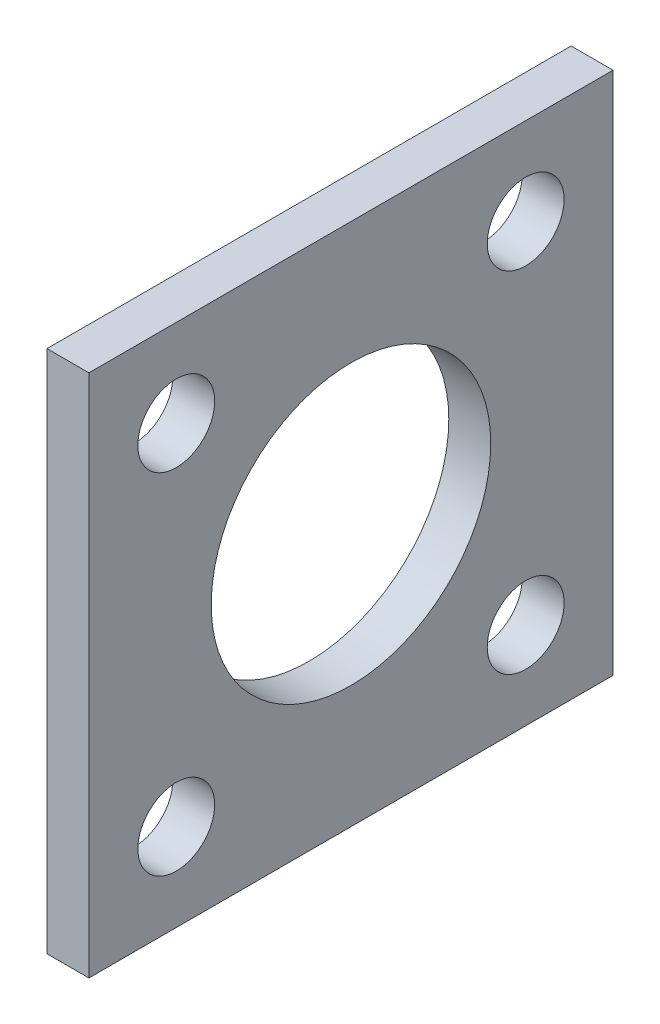
ISO-10303-21;
HEADER;
FILE_DESCRIPTION(('STEP AP214'),'2;1');
FILE_NAME('part.step','',(''),(''),'','','');
FILE_SCHEMA(('AUTOMOTIVE_DESIGN { 1 0 10303 214 1 1 1 1 }'));
ENDSEC;
DATA;
#1=APPLICATION_CONTEXT('core data for automotive mechanical design processes');
#2=APPLICATION_PROTOCOL_DEFINITION('international standard','automotive_design',2000,#1);
#3=PRODUCT_CONTEXT('',#1,'mechanical');
#4=PRODUCT('Part','Part','',(#3));
#5=PRODUCT_RELATED_PRODUCT_CATEGORY('part','',(#4));
#6=PRODUCT_DEFINITION_FORMATION('','',#4);
#7=PRODUCT_DEFINITION_CONTEXT('part definition',#1,'design');
#8=PRODUCT_DEFINITION('design','',#6,#7);
#9=PRODUCT_DEFINITION_SHAPE('','',#8);
#10=(LENGTH_UNIT() NAMED_UNIT(*) SI_UNIT(.MILLI.,.METRE.));
#11=(NAMED_UNIT(*) PLANE_ANGLE_UNIT() SI_UNIT($,.RADIAN.));
#12=(NAMED_UNIT(*) SI_UNIT($,.STERADIAN.) SOLID_ANGLE_UNIT());
#13=UNCERTAINTY_MEASURE_WITH_UNIT(LENGTH_MEASURE(1.E-05),#10,'distance_accuracy_value','');
#14=(GEOMETRIC_REPRESENTATION_CONTEXT(3) GLOBAL_UNCERTAINTY_ASSIGNED_CONTEXT((#13)) GLOBAL_UNIT_ASSIGNED_CONTEXT((#10,
#11,#12)) REPRESENTATION_CONTEXT('',''));
#15=CARTESIAN_POINT('',(0.,0.,0.));
#16=DIRECTION('',(0.,0.,1.));
#17=DIRECTION('',(1.,0.,0.));
#18=AXIS2_PLACEMENT_3D('',#15,#16,#17);
#19=CARTESIAN_POINT('',(6.,0.,0.));
#20=DIRECTION('',(1.,0.,0.));
#21=DIRECTION('',(0.,0.,-1.));
#22=AXIS2_PLACEMENT_3D('',#19,#20,#21);
#23=PLANE('',#22);
#24=CARTESIAN_POINT('',(6.,-25.,25.));
#25=DIRECTION('',(1.,0.,0.));
#26=DIRECTION('',(0.,0.,-1.));
#27=AXIS2_PLACEMENT_3D('',#24,#25,#26);
#28=CIRCLE('',#27,5.5);
#29=CARTESIAN_POINT('',(6.,-25.,19.5));
#30=VERTEX_POINT('',#29);
#31=EDGE_CURVE('E150',#30,#30,#28,.T.);
#32=ORIENTED_EDGE('',*,*,#31,.F.);
#33=EDGE_LOOP('',(#32));
#34=FACE_BOUND('',#33,.T.);
#35=CARTESIAN_POINT('',(6.,25.,25.));
#36=DIRECTION('',(1.,0.,0.));
#37=DIRECTION('',(0.,0.,1.));
#38=AXIS2_PLACEMENT_3D('',#35,#36,#37);
#39=CIRCLE('',#38,5.5);
#40=CARTESIAN_POINT('',(6.,25.,30.5));
#41=VERTEX_POINT('',#40);
#42=EDGE_CURVE('E134',#41,#41,#39,.T.);
#43=ORIENTED_EDGE('',*,*,#42,.F.);
#44=EDGE_LOOP('',(#43));
#45=FACE_BOUND('',#44,.T.);
#46=DIRECTION('',(0.,1.,0.));
#47=VECTOR('',#46,1.);
#48=CARTESIAN_POINT('',(6.,37.5,-37.5));
#49=LINE('',#48,#47);
#50=CARTESIAN_POINT('',(6.,-37.5,-37.5));
#51=VERTEX_POINT('',#50);
#52=CARTESIAN_POINT('',(6.,37.5,-37.5));
#53=VERTEX_POINT('',#52);
#54=EDGE_CURVE('E92',#51,#53,#49,.T.);
#55=ORIENTED_EDGE('',*,*,#54,.T.);
#56=DIRECTION('',(0.,0.,1.));
#57=VECTOR('',#56,1.);
#58=CARTESIAN_POINT('',(6.,37.5,37.5));
#59=LINE('',#58,#57);
#60=CARTESIAN_POINT('',(6.,37.5,37.5));
#61=VERTEX_POINT('',#60);
#62=EDGE_CURVE('E87',#53,#61,#59,.T.);
#63=ORIENTED_EDGE('',*,*,#62,.T.);
#64=DIRECTION('',(0.,-1.,0.));
#65=VECTOR('',#64,1.);
#66=CARTESIAN_POINT('',(6.,37.5,37.5));
#67=LINE('',#66,#65);
#68=CARTESIAN_POINT('',(6.,-37.5,37.5));
#69=VERTEX_POINT('',#68);
#70=EDGE_CURVE('E90',#61,#69,#67,.T.);
#71=ORIENTED_EDGE('',*,*,#70,.T.);
#72=DIRECTION('',(0.,0.,-1.));
#73=VECTOR('',#72,1.);
#74=CARTESIAN_POINT('',(6.,-37.5,37.5));
#75=LINE('',#74,#73);
#76=EDGE_CURVE('E57',#69,#51,#75,.T.);
#77=ORIENTED_EDGE('',*,*,#76,.T.);
#78=EDGE_LOOP('',(#55,#63,#71,#77));
#79=FACE_BOUND('',#78,.T.);
#80=CARTESIAN_POINT('',(6.,25.,-25.));
#81=DIRECTION('',(1.,0.,0.));
#82=DIRECTION('',(0.,0.,-1.));
#83=AXIS2_PLACEMENT_3D('',#80,#81,#82);
#84=CIRCLE('',#83,5.5);
#85=CARTESIAN_POINT('',(6.,25.,-30.5));
#86=VERTEX_POINT('',#85);
#87=EDGE_CURVE('E112',#86,#86,#84,.T.);
#88=ORIENTED_EDGE('',*,*,#87,.F.);
#89=EDGE_LOOP('',(#88));
#90=FACE_BOUND('',#89,.T.);
#91=CARTESIAN_POINT('',(6.,-25.,-25.));
#92=DIRECTION('',(1.,0.,0.));
#93=DIRECTION('',(0.,0.,1.));
#94=AXIS2_PLACEMENT_3D('',#91,#92,#93);
#95=CIRCLE('',#94,5.5);
#96=CARTESIAN_POINT('',(6.,-25.,-19.5));
#97=VERTEX_POINT('',#96);
#98=EDGE_CURVE('E142',#97,#97,#95,.T.);
#99=ORIENTED_EDGE('',*,*,#98,.F.);
#100=EDGE_LOOP('',(#99));
#101=FACE_BOUND('',#100,.T.);
#102=CARTESIAN_POINT('',(6.,0.,0.));
#103=DIRECTION('',(1.,0.,0.));
#104=DIRECTION('',(0.,0.,-1.));
#105=AXIS2_PLACEMENT_3D('',#102,#103,#104);
#106=CIRCLE('',#105,20.);
#107=CARTESIAN_POINT('',(6.,0.,-20.));
#108=VERTEX_POINT('',#107);
#109=EDGE_CURVE('E158',#108,#108,#106,.T.);
#110=ORIENTED_EDGE('',*,*,#109,.F.);
#111=EDGE_LOOP('',(#110));
#112=FACE_BOUND('',#111,.T.);
#113=ADVANCED_FACE('F39',(#34,#45,#79,#90,#101,#112),#23,.T.);
#114=CARTESIAN_POINT('',(0.,0.,0.));
#115=DIRECTION('',(1.,0.,0.));
#116=DIRECTION('',(0.,0.,-1.));
#117=AXIS2_PLACEMENT_3D('',#114,#115,#116);
#118=PLANE('',#117);
#119=DIRECTION('',(0.,1.,0.));
#120=VECTOR('',#119,1.);
#121=CARTESIAN_POINT('',(0.,37.5,-37.5));
#122=LINE('',#121,#120);
#123=CARTESIAN_POINT('',(0.,-37.5,-37.5));
#124=VERTEX_POINT('',#123);
#125=CARTESIAN_POINT('',(0.,37.5,-37.5));
#126=VERTEX_POINT('',#125);
#127=EDGE_CURVE('E108',#124,#126,#122,.T.);
#128=ORIENTED_EDGE('',*,*,#127,.F.);
#129=DIRECTION('',(0.,0.,-1.));
#130=VECTOR('',#129,1.);
#131=CARTESIAN_POINT('',(0.,-37.5,37.5));
#132=LINE('',#131,#130);
#133=CARTESIAN_POINT('',(0.,-37.5,37.5));
#134=VERTEX_POINT('',#133);
#135=EDGE_CURVE('E80',#134,#124,#132,.T.);
#136=ORIENTED_EDGE('',*,*,#135,.F.);
#137=DIRECTION('',(0.,-1.,0.));
#138=VECTOR('',#137,1.);
#139=CARTESIAN_POINT('',(0.,37.5,37.5));
#140=LINE('',#139,#138);
#141=CARTESIAN_POINT('',(0.,37.5,37.5));
#142=VERTEX_POINT('',#141);
#143=EDGE_CURVE('E74',#142,#134,#140,.T.);
#144=ORIENTED_EDGE('',*,*,#143,.F.);
#145=DIRECTION('',(0.,0.,1.));
#146=VECTOR('',#145,1.);
#147=CARTESIAN_POINT('',(0.,37.5,37.5));
#148=LINE('',#147,#146);
#149=EDGE_CURVE('E97',#126,#142,#148,.T.);
#150=ORIENTED_EDGE('',*,*,#149,.F.);
#151=EDGE_LOOP('',(#128,#136,#144,#150));
#152=FACE_BOUND('',#151,.T.);
#153=CARTESIAN_POINT('',(0.,25.,-25.));
#154=DIRECTION('',(1.,0.,0.));
#155=DIRECTION('',(0.,0.,-1.));
#156=AXIS2_PLACEMENT_3D('',#153,#154,#155);
#157=CIRCLE('',#156,5.5);
#158=CARTESIAN_POINT('',(0.,25.,-30.5));
#159=VERTEX_POINT('',#158);
#160=EDGE_CURVE('E130',#159,#159,#157,.T.);
#161=ORIENTED_EDGE('',*,*,#160,.T.);
#162=EDGE_LOOP('',(#161));
#163=FACE_BOUND('',#162,.T.);
#164=CARTESIAN_POINT('',(0.,25.,25.));
#165=DIRECTION('',(1.,0.,0.));
#166=DIRECTION('',(0.,0.,1.));
#167=AXIS2_PLACEMENT_3D('',#164,#165,#166);
#168=CIRCLE('',#167,5.5);
#169=CARTESIAN_POINT('',(0.,25.,30.5));
#170=VERTEX_POINT('',#169);
#171=EDGE_CURVE('E138',#170,#170,#168,.T.);
#172=ORIENTED_EDGE('',*,*,#171,.T.);
#173=EDGE_LOOP('',(#172));
#174=FACE_BOUND('',#173,.T.);
#175=CARTESIAN_POINT('',(0.,-25.,-25.));
#176=DIRECTION('',(1.,0.,0.));
#177=DIRECTION('',(0.,0.,1.));
#178=AXIS2_PLACEMENT_3D('',#175,#176,#177);
#179=CIRCLE('',#178,5.5);
#180=CARTESIAN_POINT('',(0.,-25.,-19.5));
#181=VERTEX_POINT('',#180);
#182=EDGE_CURVE('E146',#181,#181,#179,.T.);
#183=ORIENTED_EDGE('',*,*,#182,.T.);
#184=EDGE_LOOP('',(#183));
#185=FACE_BOUND('',#184,.T.);
#186=CARTESIAN_POINT('',(0.,-25.,25.));
#187=DIRECTION('',(1.,0.,0.));
#188=DIRECTION('',(0.,0.,-1.));
#189=AXIS2_PLACEMENT_3D('',#186,#187,#188);
#190=CIRCLE('',#189,5.5);
#191=CARTESIAN_POINT('',(0.,-25.,19.5));
#192=VERTEX_POINT('',#191);
#193=EDGE_CURVE('E154',#192,#192,#190,.T.);
#194=ORIENTED_EDGE('',*,*,#193,.T.);
#195=EDGE_LOOP('',(#194));
#196=FACE_BOUND('',#195,.T.);
#197=CARTESIAN_POINT('',(0.,0.,0.));
#198=DIRECTION('',(1.,0.,0.));
#199=DIRECTION('',(0.,0.,-1.));
#200=AXIS2_PLACEMENT_3D('',#197,#198,#199);
#201=CIRCLE('',#200,20.);
#202=CARTESIAN_POINT('',(0.,0.,-20.));
#203=VERTEX_POINT('',#202);
#204=EDGE_CURVE('E162',#203,#203,#201,.T.);
#205=ORIENTED_EDGE('',*,*,#204,.T.);
#206=EDGE_LOOP('',(#205));
#207=FACE_BOUND('',#206,.T.);
#208=ADVANCED_FACE('F125',(#152,#163,#174,#185,#196,#207),#118,.F.);
#209=CARTESIAN_POINT('',(6.,37.5,-37.5));
#210=DIRECTION('',(0.,0.,1.));
#211=DIRECTION('',(1.,0.,0.));
#212=AXIS2_PLACEMENT_3D('',#209,#210,#211);
#213=PLANE('',#212);
#214=ORIENTED_EDGE('',*,*,#127,.T.);
#215=DIRECTION('',(-1.,0.,0.));
#216=VECTOR('',#215,1.);
#217=CARTESIAN_POINT('',(6.,37.5,-37.5));
#218=LINE('',#217,#216);
#219=EDGE_CURVE('E11',#53,#126,#218,.T.);
#220=ORIENTED_EDGE('',*,*,#219,.F.);
#221=ORIENTED_EDGE('',*,*,#54,.F.);
#222=DIRECTION('',(-1.,0.,0.));
#223=VECTOR('',#222,1.);
#224=CARTESIAN_POINT('',(6.,-37.5,-37.5));
#225=LINE('',#224,#223);
#226=EDGE_CURVE('E104',#51,#124,#225,.T.);
#227=ORIENTED_EDGE('',*,*,#226,.T.);
#228=EDGE_LOOP('',(#214,#220,#221,#227));
#229=FACE_BOUND('',#228,.T.);
#230=ADVANCED_FACE('F41',(#229),#213,.F.);
#231=CARTESIAN_POINT('',(6.,37.5,37.5));
#232=DIRECTION('',(0.,-1.,0.));
#233=DIRECTION('',(0.,0.,-1.));
#234=AXIS2_PLACEMENT_3D('',#231,#232,#233);
#235=PLANE('',#234);
#236=ORIENTED_EDGE('',*,*,#149,.T.);
#237=DIRECTION('',(-1.,0.,0.));
#238=VECTOR('',#237,1.);
#239=CARTESIAN_POINT('',(6.,37.5,37.5));
#240=LINE('',#239,#238);
#241=EDGE_CURVE('E49',#61,#142,#240,.T.);
#242=ORIENTED_EDGE('',*,*,#241,.F.);
#243=ORIENTED_EDGE('',*,*,#62,.F.);
#244=ORIENTED_EDGE('',*,*,#219,.T.);
#245=EDGE_LOOP('',(#236,#242,#243,#244));
#246=FACE_BOUND('',#245,.T.);
#247=ADVANCED_FACE('F96',(#246),#235,.F.);
#248=CARTESIAN_POINT('',(6.,37.5,37.5));
#249=DIRECTION('',(0.,0.,-1.));
#250=DIRECTION('',(-1.,0.,0.));
#251=AXIS2_PLACEMENT_3D('',#248,#249,#250);
#252=PLANE('',#251);
#253=ORIENTED_EDGE('',*,*,#143,.T.);
#254=DIRECTION('',(-1.,0.,0.));
#255=VECTOR('',#254,1.);
#256=CARTESIAN_POINT('',(6.,-37.5,37.5));
#257=LINE('',#256,#255);
#258=EDGE_CURVE('E99',#69,#134,#257,.T.);
#259=ORIENTED_EDGE('',*,*,#258,.F.);
#260=ORIENTED_EDGE('',*,*,#70,.F.);
#261=ORIENTED_EDGE('',*,*,#241,.T.);
#262=EDGE_LOOP('',(#253,#259,#260,#261));
#263=FACE_BOUND('',#262,.T.);
#264=ADVANCED_FACE('F100',(#263),#252,.F.);
#265=CARTESIAN_POINT('',(6.,-37.5,37.5));
#266=DIRECTION('',(0.,1.,0.));
#267=DIRECTION('',(0.,0.,1.));
#268=AXIS2_PLACEMENT_3D('',#265,#266,#267);
#269=PLANE('',#268);
#270=ORIENTED_EDGE('',*,*,#135,.T.);
#271=ORIENTED_EDGE('',*,*,#226,.F.);
#272=ORIENTED_EDGE('',*,*,#76,.F.);
#273=ORIENTED_EDGE('',*,*,#258,.T.);
#274=EDGE_LOOP('',(#270,#271,#272,#273));
#275=FACE_BOUND('',#274,.T.);
#276=ADVANCED_FACE('F122',(#275),#269,.F.);
#277=CARTESIAN_POINT('',(6.,25.,-25.));
#278=DIRECTION('',(-1.,0.,0.));
#279=DIRECTION('',(0.,0.,1.));
#280=AXIS2_PLACEMENT_3D('',#277,#278,#279);
#281=CYLINDRICAL_SURFACE('',#280,5.5);
#282=ORIENTED_EDGE('',*,*,#87,.T.);
#283=EDGE_LOOP('',(#282));
#284=FACE_BOUND('',#283,.T.);
#285=ORIENTED_EDGE('',*,*,#160,.F.);
#286=EDGE_LOOP('',(#285));
#287=FACE_BOUND('',#286,.T.);
#288=ADVANCED_FACE('F183',(#284,#287),#281,.F.);
#289=CARTESIAN_POINT('',(6.,25.,25.));
#290=DIRECTION('',(-1.,0.,0.));
#291=DIRECTION('',(0.,0.,1.));
#292=AXIS2_PLACEMENT_3D('',#289,#290,#291);
#293=CYLINDRICAL_SURFACE('',#292,5.5);
#294=ORIENTED_EDGE('',*,*,#42,.T.);
#295=EDGE_LOOP('',(#294));
#296=FACE_BOUND('',#295,.T.);
#297=ORIENTED_EDGE('',*,*,#171,.F.);
#298=EDGE_LOOP('',(#297));
#299=FACE_BOUND('',#298,.T.);
#300=ADVANCED_FACE('F229',(#296,#299),#293,.F.);
#301=CARTESIAN_POINT('',(6.,-25.,-25.));
#302=DIRECTION('',(-1.,0.,0.));
#303=DIRECTION('',(0.,0.,1.));
#304=AXIS2_PLACEMENT_3D('',#301,#302,#303);
#305=CYLINDRICAL_SURFACE('',#304,5.5);
#306=ORIENTED_EDGE('',*,*,#98,.T.);
#307=EDGE_LOOP('',(#306));
#308=FACE_BOUND('',#307,.T.);
#309=ORIENTED_EDGE('',*,*,#182,.F.);
#310=EDGE_LOOP('',(#309));
#311=FACE_BOUND('',#310,.T.);
#312=ADVANCED_FACE('F237',(#308,#311),#305,.F.);
#313=CARTESIAN_POINT('',(6.,-25.,25.));
#314=DIRECTION('',(-1.,0.,0.));
#315=DIRECTION('',(0.,0.,1.));
#316=AXIS2_PLACEMENT_3D('',#313,#314,#315);
#317=CYLINDRICAL_SURFACE('',#316,5.5);
#318=ORIENTED_EDGE('',*,*,#31,.T.);
#319=EDGE_LOOP('',(#318));
#320=FACE_BOUND('',#319,.T.);
#321=ORIENTED_EDGE('',*,*,#193,.F.);
#322=EDGE_LOOP('',(#321));
#323=FACE_BOUND('',#322,.T.);
#324=ADVANCED_FACE('F245',(#320,#323),#317,.F.);
#325=CARTESIAN_POINT('',(6.,0.,0.));
#326=DIRECTION('',(-1.,0.,0.));
#327=DIRECTION('',(0.,0.,1.));
#328=AXIS2_PLACEMENT_3D('',#325,#326,#327);
#329=CYLINDRICAL_SURFACE('',#328,20.);
#330=ORIENTED_EDGE('',*,*,#109,.T.);
#331=EDGE_LOOP('',(#330));
#332=FACE_BOUND('',#331,.T.);
#333=ORIENTED_EDGE('',*,*,#204,.F.);
#334=EDGE_LOOP('',(#333));
#335=FACE_BOUND('',#334,.T.);
#336=ADVANCED_FACE('F170',(#332,#335),#329,.F.);
#337=CLOSED_SHELL('',(#113,#208,#230,#247,#264,#276,#288,#300,#312,#324,#336));
#338=MANIFOLD_SOLID_BREP('B2',#337);
#339=ADVANCED_BREP_SHAPE_REPRESENTATION('',(#18,#338),#14);
#340=SHAPE_DEFINITION_REPRESENTATION(#9,#339);
ENDSEC;
END-ISO-10303-21;
